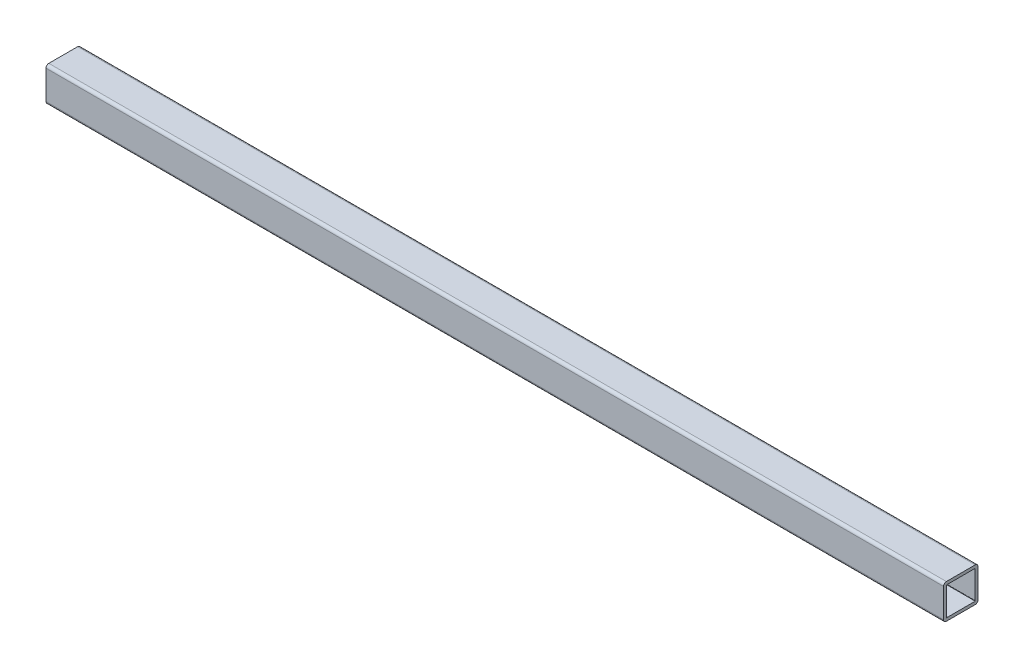
ISO-10303-21;
HEADER;
FILE_DESCRIPTION(('STEP AP214'),'2;1');
FILE_NAME('part.step','',(''),(''),'','','');
FILE_SCHEMA(('AUTOMOTIVE_DESIGN { 1 0 10303 214 1 1 1 1 }'));
ENDSEC;
DATA;
#1=APPLICATION_CONTEXT('core data for automotive mechanical design processes');
#2=APPLICATION_PROTOCOL_DEFINITION('international standard','automotive_design',2000,#1);
#3=PRODUCT_CONTEXT('',#1,'mechanical');
#4=PRODUCT('Part','Part','',(#3));
#5=PRODUCT_RELATED_PRODUCT_CATEGORY('part','',(#4));
#6=PRODUCT_DEFINITION_FORMATION('','',#4);
#7=PRODUCT_DEFINITION_CONTEXT('part definition',#1,'design');
#8=PRODUCT_DEFINITION('design','',#6,#7);
#9=PRODUCT_DEFINITION_SHAPE('','',#8);
#10=(LENGTH_UNIT() NAMED_UNIT(*) SI_UNIT(.MILLI.,.METRE.));
#11=(NAMED_UNIT(*) PLANE_ANGLE_UNIT() SI_UNIT($,.RADIAN.));
#12=(NAMED_UNIT(*) SI_UNIT($,.STERADIAN.) SOLID_ANGLE_UNIT());
#13=UNCERTAINTY_MEASURE_WITH_UNIT(LENGTH_MEASURE(1.E-05),#10,'distance_accuracy_value','');
#14=(GEOMETRIC_REPRESENTATION_CONTEXT(3) GLOBAL_UNCERTAINTY_ASSIGNED_CONTEXT((#13)) GLOBAL_UNIT_ASSIGNED_CONTEXT((#10,
#11,#12)) REPRESENTATION_CONTEXT('',''));
#15=CARTESIAN_POINT('',(0.,0.,0.));
#16=DIRECTION('',(0.,0.,1.));
#17=DIRECTION('',(1.,0.,0.));
#18=AXIS2_PLACEMENT_3D('',#15,#16,#17);
#19=CARTESIAN_POINT('',(0.,7.90752776427933,24.0377469296004));
#20=DIRECTION('',(1.,0.,0.));
#21=DIRECTION('',(0.,0.,-1.));
#22=AXIS2_PLACEMENT_3D('',#19,#20,#21);
#23=PLANE('',#22);
#24=CARTESIAN_POINT('',(0.,7.90752776427933,24.0377469296004));
#25=DIRECTION('',(1.,0.,0.));
#26=DIRECTION('',(0.,0.,-1.));
#27=AXIS2_PLACEMENT_3D('',#24,#25,#26);
#28=CIRCLE('',#27,1.55033438425608);
#29=CARTESIAN_POINT('',(0.,7.90752776427933,25.5880813138565));
#30=VERTEX_POINT('',#29);
#31=CARTESIAN_POINT('',(0.,6.35719338002325,24.0377469296004));
#32=VERTEX_POINT('',#31);
#33=EDGE_CURVE('E202',#30,#32,#28,.T.);
#34=ORIENTED_EDGE('',*,*,#33,.F.);
#35=DIRECTION('',(0.,-1.,0.));
#36=VECTOR('',#35,1.);
#37=CARTESIAN_POINT('',(0.,23.8568589957672,25.5880813138565));
#38=LINE('',#37,#36);
#39=CARTESIAN_POINT('',(0.,23.8568589957672,25.5880813138565));
#40=VERTEX_POINT('',#39);
#41=EDGE_CURVE('E174',#40,#30,#38,.T.);
#42=ORIENTED_EDGE('',*,*,#41,.F.);
#43=CARTESIAN_POINT('',(0.,23.8568589957672,24.0377469296004));
#44=DIRECTION('',(1.,0.,0.));
#45=DIRECTION('',(0.,0.,-1.));
#46=AXIS2_PLACEMENT_3D('',#43,#44,#45);
#47=CIRCLE('',#46,1.55033438425608);
#48=CARTESIAN_POINT('',(0.,25.4071933800233,24.0377469296004));
#49=VERTEX_POINT('',#48);
#50=EDGE_CURVE('E180',#49,#40,#47,.T.);
#51=ORIENTED_EDGE('',*,*,#50,.F.);
#52=DIRECTION('',(0.,0.,1.));
#53=VECTOR('',#52,1.);
#54=CARTESIAN_POINT('',(0.,25.4071933800233,8.08841569811253));
#55=LINE('',#54,#53);
#56=CARTESIAN_POINT('',(0.,25.4071933800233,8.08841569811253));
#57=VERTEX_POINT('',#56);
#58=EDGE_CURVE('E187',#57,#49,#55,.T.);
#59=ORIENTED_EDGE('',*,*,#58,.F.);
#60=CARTESIAN_POINT('',(0.,23.8568589957672,8.08841569811253));
#61=DIRECTION('',(1.,0.,0.));
#62=DIRECTION('',(0.,0.,-1.));
#63=AXIS2_PLACEMENT_3D('',#60,#61,#62);
#64=CIRCLE('',#63,1.55033438425608);
#65=CARTESIAN_POINT('',(0.,23.8568589957672,6.53808131385646));
#66=VERTEX_POINT('',#65);
#67=EDGE_CURVE('E190',#66,#57,#64,.T.);
#68=ORIENTED_EDGE('',*,*,#67,.F.);
#69=DIRECTION('',(0.,1.,0.));
#70=VECTOR('',#69,1.);
#71=CARTESIAN_POINT('',(0.,7.90752776427933,6.53808131385646));
#72=LINE('',#71,#70);
#73=CARTESIAN_POINT('',(0.,7.90752776427933,6.53808131385646));
#74=VERTEX_POINT('',#73);
#75=EDGE_CURVE('E193',#74,#66,#72,.T.);
#76=ORIENTED_EDGE('',*,*,#75,.F.);
#77=CARTESIAN_POINT('',(0.,7.90752776427933,8.08841569811253));
#78=DIRECTION('',(1.,0.,0.));
#79=DIRECTION('',(0.,0.,-1.));
#80=AXIS2_PLACEMENT_3D('',#77,#78,#79);
#81=CIRCLE('',#80,1.55033438425607);
#82=CARTESIAN_POINT('',(0.,6.35719338002325,8.08841569811253));
#83=VERTEX_POINT('',#82);
#84=EDGE_CURVE('E196',#83,#74,#81,.T.);
#85=ORIENTED_EDGE('',*,*,#84,.F.);
#86=DIRECTION('',(0.,0.,-1.));
#87=VECTOR('',#86,1.);
#88=CARTESIAN_POINT('',(0.,6.35719338002325,24.0377469296004));
#89=LINE('',#88,#87);
#90=EDGE_CURVE('E199',#32,#83,#89,.T.);
#91=ORIENTED_EDGE('',*,*,#90,.F.);
#92=EDGE_LOOP('',(#34,#42,#51,#59,#68,#76,#85,#91));
#93=FACE_BOUND('',#92,.T.);
#94=CARTESIAN_POINT('',(0.,8.04464893999163,8.59516085462564));
#95=DIRECTION('',(1.,0.,0.));
#96=DIRECTION('',(0.,0.,-1.));
#97=AXIS2_PLACEMENT_3D('',#94,#95,#96);
#98=CIRCLE('',#97,0.533400000000004);
#99=CARTESIAN_POINT('',(0.,8.00819338002325,8.06300810198088));
#100=VERTEX_POINT('',#99);
#101=CARTESIAN_POINT('',(0.,8.39050290710592,8.18908131385644));
#102=VERTEX_POINT('',#101);
#103=EDGE_CURVE('E169',#100,#102,#98,.T.);
#104=ORIENTED_EDGE('',*,*,#103,.T.);
#105=DIRECTION('',(0.,1.,0.));
#106=VECTOR('',#105,1.);
#107=CARTESIAN_POINT('',(0.,8.39050290710592,8.18908131385644));
#108=LINE('',#107,#106);
#109=CARTESIAN_POINT('',(0.,23.7311761189815,8.18908131385644));
#110=VERTEX_POINT('',#109);
#111=EDGE_CURVE('E205',#102,#110,#108,.T.);
#112=ORIENTED_EDGE('',*,*,#111,.T.);
#113=CARTESIAN_POINT('',(0.,24.2630721074737,8.22910902208072));
#114=DIRECTION('',(1.,0.,0.));
#115=DIRECTION('',(0.,0.,-1.));
#116=AXIS2_PLACEMENT_3D('',#113,#114,#115);
#117=CIRCLE('',#116,0.533399999999851);
#118=CARTESIAN_POINT('',(0.,23.7561933800233,8.06300810198088));
#119=VERTEX_POINT('',#118);
#120=EDGE_CURVE('E208',#110,#119,#117,.T.);
#121=ORIENTED_EDGE('',*,*,#120,.T.);
#122=DIRECTION('',(0.,0.,1.));
#123=VECTOR('',#122,1.);
#124=CARTESIAN_POINT('',(0.,23.7561933800233,8.06300810198088));
#125=LINE('',#124,#123);
#126=CARTESIAN_POINT('',(0.,23.7561933800233,23.4036813138565));
#127=VERTEX_POINT('',#126);
#128=EDGE_CURVE('E211',#119,#127,#125,.T.);
#129=ORIENTED_EDGE('',*,*,#128,.T.);
#130=CARTESIAN_POINT('',(0.,23.2227933800232,23.4036813138564));
#131=DIRECTION('',(1.,0.,0.));
#132=DIRECTION('',(0.,0.,-1.));
#133=AXIS2_PLACEMENT_3D('',#130,#131,#132);
#134=CIRCLE('',#133,0.53340000000001);
#135=CARTESIAN_POINT('',(0.,23.2227933800233,23.9370813138565));
#136=VERTEX_POINT('',#135);
#137=EDGE_CURVE('E214',#127,#136,#134,.T.);
#138=ORIENTED_EDGE('',*,*,#137,.T.);
#139=DIRECTION('',(0.,-1.,0.));
#140=VECTOR('',#139,1.);
#141=CARTESIAN_POINT('',(0.,23.2227933800233,23.9370813138565));
#142=LINE('',#141,#140);
#143=CARTESIAN_POINT('',(0.,7.88212016814768,23.9370813138565));
#144=VERTEX_POINT('',#143);
#145=EDGE_CURVE('E217',#136,#144,#142,.T.);
#146=ORIENTED_EDGE('',*,*,#145,.T.);
#147=CARTESIAN_POINT('',(0.,8.39050290710591,23.7756423138307));
#148=DIRECTION('',(1.,0.,0.));
#149=DIRECTION('',(0.,0.,-1.));
#150=AXIS2_PLACEMENT_3D('',#147,#148,#149);
#151=CIRCLE('',#150,0.533400000000001);
#152=CARTESIAN_POINT('',(0.,8.00819338002324,23.4036813138565));
#153=VERTEX_POINT('',#152);
#154=EDGE_CURVE('E220',#144,#153,#151,.T.);
#155=ORIENTED_EDGE('',*,*,#154,.T.);
#156=DIRECTION('',(0.,0.,-1.));
#157=VECTOR('',#156,1.);
#158=CARTESIAN_POINT('',(0.,8.00819338002325,23.4036813138565));
#159=LINE('',#158,#157);
#160=EDGE_CURVE('E223',#153,#100,#159,.T.);
#161=ORIENTED_EDGE('',*,*,#160,.T.);
#162=EDGE_LOOP('',(#104,#112,#121,#129,#138,#146,#155,#161));
#163=FACE_BOUND('',#162,.T.);
#164=ADVANCED_FACE('F44',(#93,#163),#23,.F.);
#165=CARTESIAN_POINT('',(609.6,7.90752776427933,24.0377469296004));
#166=DIRECTION('',(-1.,0.,0.));
#167=DIRECTION('',(0.,-1.,0.));
#168=AXIS2_PLACEMENT_3D('',#165,#166,#167);
#169=CYLINDRICAL_SURFACE('',#168,1.55033438425608);
#170=DIRECTION('',(-1.,0.,0.));
#171=VECTOR('',#170,1.);
#172=CARTESIAN_POINT('',(609.6,6.35719338002325,24.0377469296004));
#173=LINE('',#172,#171);
#174=CARTESIAN_POINT('',(496.059468438549,6.35719338002325,24.0377469296004));
#175=VERTEX_POINT('',#174);
#176=EDGE_CURVE('E52',#175,#32,#173,.T.);
#177=ORIENTED_EDGE('',*,*,#176,.F.);
#178=CARTESIAN_POINT('',(496.059468438549,7.90752776427526,24.0377469296004));
#179=DIRECTION('',(-1.,0.,0.));
#180=DIRECTION('',(0.,-1.,0.));
#181=AXIS2_PLACEMENT_3D('',#178,#179,#180);
#182=CIRCLE('',#181,1.55033438425608);
#183=CARTESIAN_POINT('',(496.059468438549,7.90752776427933,25.5880813138565));
#184=VERTEX_POINT('',#183);
#185=EDGE_CURVE('E156',#175,#184,#182,.T.);
#186=ORIENTED_EDGE('',*,*,#185,.T.);
#187=DIRECTION('',(-1.,0.,0.));
#188=VECTOR('',#187,1.);
#189=CARTESIAN_POINT('',(609.6,7.90752776427933,25.5880813138565));
#190=LINE('',#189,#188);
#191=EDGE_CURVE('E167',#184,#30,#190,.T.);
#192=ORIENTED_EDGE('',*,*,#191,.T.);
#193=ORIENTED_EDGE('',*,*,#33,.T.);
#194=EDGE_LOOP('',(#177,#186,#192,#193));
#195=FACE_BOUND('',#194,.T.);
#196=ADVANCED_FACE('F165',(#195),#169,.T.);
#197=CARTESIAN_POINT('',(609.6,6.35719338002325,24.0377469296004));
#198=DIRECTION('',(0.,1.,0.));
#199=DIRECTION('',(0.,0.,1.));
#200=AXIS2_PLACEMENT_3D('',#197,#198,#199);
#201=PLANE('',#200);
#202=DIRECTION('',(-1.,0.,0.));
#203=VECTOR('',#202,1.);
#204=CARTESIAN_POINT('',(609.6,6.35719338002325,8.08841569811253));
#205=LINE('',#204,#203);
#206=CARTESIAN_POINT('',(496.059468438549,6.35719338002325,8.08841569811253));
#207=VERTEX_POINT('',#206);
#208=EDGE_CURVE('E227',#207,#83,#205,.T.);
#209=ORIENTED_EDGE('',*,*,#208,.F.);
#210=DIRECTION('',(0.,0.,1.));
#211=VECTOR('',#210,1.);
#212=CARTESIAN_POINT('',(496.059468438549,6.35719338002325,6.53808131385646));
#213=LINE('',#212,#211);
#214=EDGE_CURVE('E296',#207,#175,#213,.T.);
#215=ORIENTED_EDGE('',*,*,#214,.T.);
#216=ORIENTED_EDGE('',*,*,#176,.T.);
#217=ORIENTED_EDGE('',*,*,#90,.T.);
#218=EDGE_LOOP('',(#209,#215,#216,#217));
#219=FACE_BOUND('',#218,.T.);
#220=ADVANCED_FACE('F295',(#219),#201,.F.);
#221=CARTESIAN_POINT('',(609.6,7.90752776427933,8.08841569811253));
#222=DIRECTION('',(-1.,0.,0.));
#223=DIRECTION('',(0.,-1.,0.));
#224=AXIS2_PLACEMENT_3D('',#221,#222,#223);
#225=CYLINDRICAL_SURFACE('',#224,1.55033438425608);
#226=DIRECTION('',(-1.,0.,0.));
#227=VECTOR('',#226,1.);
#228=CARTESIAN_POINT('',(609.6,7.90752776427933,6.53808131385646));
#229=LINE('',#228,#227);
#230=CARTESIAN_POINT('',(496.059468438549,7.90752776427933,6.53808131385646));
#231=VERTEX_POINT('',#230);
#232=EDGE_CURVE('E229',#231,#74,#229,.T.);
#233=ORIENTED_EDGE('',*,*,#232,.F.);
#234=CARTESIAN_POINT('',(496.059468438549,7.90752776427526,8.08841569811253));
#235=DIRECTION('',(-1.,0.,0.));
#236=DIRECTION('',(0.,-1.,0.));
#237=AXIS2_PLACEMENT_3D('',#234,#235,#236);
#238=CIRCLE('',#237,1.55033438425608);
#239=EDGE_CURVE('E170',#231,#207,#238,.T.);
#240=ORIENTED_EDGE('',*,*,#239,.T.);
#241=ORIENTED_EDGE('',*,*,#208,.T.);
#242=ORIENTED_EDGE('',*,*,#84,.T.);
#243=EDGE_LOOP('',(#233,#240,#241,#242));
#244=FACE_BOUND('',#243,.T.);
#245=ADVANCED_FACE('F305',(#244),#225,.T.);
#246=CARTESIAN_POINT('',(609.6,7.90752776427933,6.53808131385646));
#247=DIRECTION('',(0.,0.,1.));
#248=DIRECTION('',(0.,-1.,0.));
#249=AXIS2_PLACEMENT_3D('',#246,#247,#248);
#250=PLANE('',#249);
#251=DIRECTION('',(-1.,0.,0.));
#252=VECTOR('',#251,1.);
#253=CARTESIAN_POINT('',(609.6,23.8568589957672,6.53808131385646));
#254=LINE('',#253,#252);
#255=CARTESIAN_POINT('',(496.059468438549,23.8568589957651,6.53808131385646));
#256=VERTEX_POINT('',#255);
#257=EDGE_CURVE('E231',#256,#66,#254,.T.);
#258=ORIENTED_EDGE('',*,*,#257,.F.);
#259=DIRECTION('',(0.,-1.,0.));
#260=VECTOR('',#259,1.);
#261=CARTESIAN_POINT('',(496.059468438549,25.4071933800233,6.53808131385646));
#262=LINE('',#261,#260);
#263=EDGE_CURVE('E161',#256,#231,#262,.T.);
#264=ORIENTED_EDGE('',*,*,#263,.T.);
#265=ORIENTED_EDGE('',*,*,#232,.T.);
#266=ORIENTED_EDGE('',*,*,#75,.T.);
#267=EDGE_LOOP('',(#258,#264,#265,#266));
#268=FACE_BOUND('',#267,.T.);
#269=ADVANCED_FACE('F303',(#268),#250,.F.);
#270=CARTESIAN_POINT('',(609.6,23.8568589957672,8.08841569811253));
#271=DIRECTION('',(-1.,0.,0.));
#272=DIRECTION('',(0.,-1.,0.));
#273=AXIS2_PLACEMENT_3D('',#270,#271,#272);
#274=CYLINDRICAL_SURFACE('',#273,1.55033438425608);
#275=DIRECTION('',(-1.,0.,0.));
#276=VECTOR('',#275,1.);
#277=CARTESIAN_POINT('',(609.6,25.4071933800233,8.08841569811253));
#278=LINE('',#277,#276);
#279=CARTESIAN_POINT('',(496.059468438549,25.4071933800233,8.08841569811253));
#280=VERTEX_POINT('',#279);
#281=EDGE_CURVE('E233',#280,#57,#278,.T.);
#282=ORIENTED_EDGE('',*,*,#281,.F.);
#283=CARTESIAN_POINT('',(496.059468438549,23.8568589957631,8.08841569811253));
#284=DIRECTION('',(-1.,0.,0.));
#285=DIRECTION('',(0.,-1.,0.));
#286=AXIS2_PLACEMENT_3D('',#283,#284,#285);
#287=CIRCLE('',#286,1.55033438425608);
#288=EDGE_CURVE('E284',#280,#256,#287,.T.);
#289=ORIENTED_EDGE('',*,*,#288,.T.);
#290=ORIENTED_EDGE('',*,*,#257,.T.);
#291=ORIENTED_EDGE('',*,*,#67,.T.);
#292=EDGE_LOOP('',(#282,#289,#290,#291));
#293=FACE_BOUND('',#292,.T.);
#294=ADVANCED_FACE('F310',(#293),#274,.T.);
#295=CARTESIAN_POINT('',(609.6,25.4071933800233,8.08841569811253));
#296=DIRECTION('',(0.,-1.,0.));
#297=DIRECTION('',(0.,0.,-1.));
#298=AXIS2_PLACEMENT_3D('',#295,#296,#297);
#299=PLANE('',#298);
#300=DIRECTION('',(-1.,0.,0.));
#301=VECTOR('',#300,1.);
#302=CARTESIAN_POINT('',(609.6,25.4071933800233,24.0377469296004));
#303=LINE('',#302,#301);
#304=CARTESIAN_POINT('',(496.059468438549,25.4071933800233,24.0377469296004));
#305=VERTEX_POINT('',#304);
#306=EDGE_CURVE('E178',#305,#49,#303,.T.);
#307=ORIENTED_EDGE('',*,*,#306,.F.);
#308=DIRECTION('',(0.,0.,1.));
#309=VECTOR('',#308,1.);
#310=CARTESIAN_POINT('',(496.059468438549,25.4071933800233,6.53808131385646));
#311=LINE('',#310,#309);
#312=EDGE_CURVE('E273',#280,#305,#311,.T.);
#313=ORIENTED_EDGE('',*,*,#312,.F.);
#314=ORIENTED_EDGE('',*,*,#281,.T.);
#315=ORIENTED_EDGE('',*,*,#58,.T.);
#316=EDGE_LOOP('',(#307,#313,#314,#315));
#317=FACE_BOUND('',#316,.T.);
#318=ADVANCED_FACE('F314',(#317),#299,.F.);
#319=CARTESIAN_POINT('',(609.6,23.8568589957672,24.0377469296004));
#320=DIRECTION('',(-1.,0.,0.));
#321=DIRECTION('',(0.,-1.,0.));
#322=AXIS2_PLACEMENT_3D('',#319,#320,#321);
#323=CYLINDRICAL_SURFACE('',#322,1.55033438425608);
#324=DIRECTION('',(-1.,0.,0.));
#325=VECTOR('',#324,1.);
#326=CARTESIAN_POINT('',(609.6,23.8568589957672,25.5880813138565));
#327=LINE('',#326,#325);
#328=CARTESIAN_POINT('',(496.059468438549,23.8568589957672,25.5880813138565));
#329=VERTEX_POINT('',#328);
#330=EDGE_CURVE('E176',#329,#40,#327,.T.);
#331=ORIENTED_EDGE('',*,*,#330,.F.);
#332=CARTESIAN_POINT('',(496.059468438549,23.8568589957631,24.0377469296004));
#333=DIRECTION('',(-1.,0.,0.));
#334=DIRECTION('',(0.,-1.,0.));
#335=AXIS2_PLACEMENT_3D('',#332,#333,#334);
#336=CIRCLE('',#335,1.55033438425608);
#337=EDGE_CURVE('E59',#329,#305,#336,.T.);
#338=ORIENTED_EDGE('',*,*,#337,.T.);
#339=ORIENTED_EDGE('',*,*,#306,.T.);
#340=ORIENTED_EDGE('',*,*,#50,.T.);
#341=EDGE_LOOP('',(#331,#338,#339,#340));
#342=FACE_BOUND('',#341,.T.);
#343=ADVANCED_FACE('F316',(#342),#323,.T.);
#344=CARTESIAN_POINT('',(609.6,23.8568589957672,25.5880813138565));
#345=DIRECTION('',(0.,0.,-1.));
#346=DIRECTION('',(0.,1.,0.));
#347=AXIS2_PLACEMENT_3D('',#344,#345,#346);
#348=PLANE('',#347);
#349=ORIENTED_EDGE('',*,*,#191,.F.);
#350=DIRECTION('',(0.,-1.,0.));
#351=VECTOR('',#350,1.);
#352=CARTESIAN_POINT('',(496.059468438549,25.4071933800233,25.5880813138565));
#353=LINE('',#352,#351);
#354=EDGE_CURVE('E153',#329,#184,#353,.T.);
#355=ORIENTED_EDGE('',*,*,#354,.F.);
#356=ORIENTED_EDGE('',*,*,#330,.T.);
#357=ORIENTED_EDGE('',*,*,#41,.T.);
#358=EDGE_LOOP('',(#349,#355,#356,#357));
#359=FACE_BOUND('',#358,.T.);
#360=ADVANCED_FACE('F172',(#359),#348,.F.);
#361=CARTESIAN_POINT('',(609.6,8.04464893999163,8.59516085462564));
#362=DIRECTION('',(-1.,-1.04070399758638E-13,0.));
#363=DIRECTION('',(1.04070399758638E-13,-1.,0.));
#364=AXIS2_PLACEMENT_3D('',#361,#362,#363);
#365=CYLINDRICAL_SURFACE('',#364,0.533400000000002);
#366=CARTESIAN_POINT('',(496.059468438549,8.04464893997982,8.59516085462564));
#367=DIRECTION('',(-1.,0.,0.));
#368=DIRECTION('',(0.,-1.,0.));
#369=AXIS2_PLACEMENT_3D('',#366,#367,#368);
#370=CIRCLE('',#369,0.533400000000002);
#371=CARTESIAN_POINT('',(496.059468438549,8.39050290710592,8.18908131385644));
#372=VERTEX_POINT('',#371);
#373=CARTESIAN_POINT('',(496.059468438549,8.00819338002325,8.06300810198088));
#374=VERTEX_POINT('',#373);
#375=EDGE_CURVE('E66',#372,#374,#370,.T.);
#376=ORIENTED_EDGE('',*,*,#375,.F.);
#377=DIRECTION('',(-1.,0.,0.));
#378=VECTOR('',#377,1.);
#379=CARTESIAN_POINT('',(609.6,8.39050290710592,8.18908131385644));
#380=LINE('',#379,#378);
#381=EDGE_CURVE('E238',#372,#102,#380,.T.);
#382=ORIENTED_EDGE('',*,*,#381,.T.);
#383=ORIENTED_EDGE('',*,*,#103,.F.);
#384=DIRECTION('',(-1.,0.,0.));
#385=VECTOR('',#384,1.);
#386=CARTESIAN_POINT('',(609.6,8.00819338002325,8.06300810198088));
#387=LINE('',#386,#385);
#388=EDGE_CURVE('E226',#374,#100,#387,.T.);
#389=ORIENTED_EDGE('',*,*,#388,.F.);
#390=EDGE_LOOP('',(#376,#382,#383,#389));
#391=FACE_BOUND('',#390,.T.);
#392=ADVANCED_FACE('F323',(#391),#365,.F.);
#393=CARTESIAN_POINT('',(609.6,8.39050290710592,8.18908131385644));
#394=DIRECTION('',(0.,0.,1.));
#395=DIRECTION('',(1.,0.,0.));
#396=AXIS2_PLACEMENT_3D('',#393,#394,#395);
#397=PLANE('',#396);
#398=DIRECTION('',(0.,-1.,0.));
#399=VECTOR('',#398,1.);
#400=CARTESIAN_POINT('',(496.059468438549,8.39050290710525,8.18908131385644));
#401=LINE('',#400,#399);
#402=CARTESIAN_POINT('',(496.059468438549,23.7311761189697,8.18908131385556));
#403=VERTEX_POINT('',#402);
#404=EDGE_CURVE('E280',#403,#372,#401,.T.);
#405=ORIENTED_EDGE('',*,*,#404,.F.);
#406=DIRECTION('',(-1.,0.,0.));
#407=VECTOR('',#406,1.);
#408=CARTESIAN_POINT('',(609.6,23.7311761189815,8.18908131385644));
#409=LINE('',#408,#407);
#410=EDGE_CURVE('E240',#403,#110,#409,.T.);
#411=ORIENTED_EDGE('',*,*,#410,.T.);
#412=ORIENTED_EDGE('',*,*,#111,.F.);
#413=ORIENTED_EDGE('',*,*,#381,.F.);
#414=EDGE_LOOP('',(#405,#411,#412,#413));
#415=FACE_BOUND('',#414,.T.);
#416=ADVANCED_FACE('F374',(#415),#397,.T.);
#417=CARTESIAN_POINT('',(609.6,24.2630721074739,8.22910902208074));
#418=DIRECTION('',(-1.,-1.04070399758638E-13,0.));
#419=DIRECTION('',(1.04070399758638E-13,-1.,0.));
#420=AXIS2_PLACEMENT_3D('',#417,#418,#419);
#421=CYLINDRICAL_SURFACE('',#420,0.533400000000003);
#422=CARTESIAN_POINT('',(496.059468438549,24.2630721074621,8.22910902208074));
#423=DIRECTION('',(-1.,0.,0.));
#424=DIRECTION('',(0.,-1.,0.));
#425=AXIS2_PLACEMENT_3D('',#422,#423,#424);
#426=CIRCLE('',#425,0.533400000000003);
#427=CARTESIAN_POINT('',(496.059468438549,23.7561933800233,8.06300810198088));
#428=VERTEX_POINT('',#427);
#429=EDGE_CURVE('E278',#428,#403,#426,.T.);
#430=ORIENTED_EDGE('',*,*,#429,.F.);
#431=DIRECTION('',(-1.,0.,0.));
#432=VECTOR('',#431,1.);
#433=CARTESIAN_POINT('',(609.6,23.7561933800233,8.06300810198088));
#434=LINE('',#433,#432);
#435=EDGE_CURVE('E242',#428,#119,#434,.T.);
#436=ORIENTED_EDGE('',*,*,#435,.T.);
#437=ORIENTED_EDGE('',*,*,#120,.F.);
#438=ORIENTED_EDGE('',*,*,#410,.F.);
#439=EDGE_LOOP('',(#430,#436,#437,#438));
#440=FACE_BOUND('',#439,.T.);
#441=ADVANCED_FACE('F383',(#440),#421,.F.);
#442=CARTESIAN_POINT('',(609.6,23.7561933800233,8.06300810198088));
#443=DIRECTION('',(0.,-1.,0.));
#444=DIRECTION('',(0.,0.,-1.));
#445=AXIS2_PLACEMENT_3D('',#442,#443,#444);
#446=PLANE('',#445);
#447=DIRECTION('',(0.,0.,-1.));
#448=VECTOR('',#447,1.);
#449=CARTESIAN_POINT('',(496.059468438549,23.7561933800233,8.06300810198088));
#450=LINE('',#449,#448);
#451=CARTESIAN_POINT('',(496.059468438549,23.7561933800114,23.4036813138565));
#452=VERTEX_POINT('',#451);
#453=EDGE_CURVE('E271',#452,#428,#450,.T.);
#454=ORIENTED_EDGE('',*,*,#453,.F.);
#455=DIRECTION('',(-1.,0.,0.));
#456=VECTOR('',#455,1.);
#457=CARTESIAN_POINT('',(609.6,23.7561933800233,23.4036813138565));
#458=LINE('',#457,#456);
#459=EDGE_CURVE('E244',#452,#127,#458,.T.);
#460=ORIENTED_EDGE('',*,*,#459,.T.);
#461=ORIENTED_EDGE('',*,*,#128,.F.);
#462=ORIENTED_EDGE('',*,*,#435,.F.);
#463=EDGE_LOOP('',(#454,#460,#461,#462));
#464=FACE_BOUND('',#463,.T.);
#465=ADVANCED_FACE('F392',(#464),#446,.T.);
#466=CARTESIAN_POINT('',(609.6,23.2227933800233,23.4036813138565));
#467=DIRECTION('',(-1.,-1.04070399758638E-13,0.));
#468=DIRECTION('',(1.04070399758638E-13,-1.,0.));
#469=AXIS2_PLACEMENT_3D('',#466,#467,#468);
#470=CYLINDRICAL_SURFACE('',#469,0.533400000000003);
#471=CARTESIAN_POINT('',(496.059468438549,23.2227933800114,23.4036813138565));
#472=DIRECTION('',(-1.,0.,0.));
#473=DIRECTION('',(0.,-1.,0.));
#474=AXIS2_PLACEMENT_3D('',#471,#472,#473);
#475=CIRCLE('',#474,0.533400000000003);
#476=CARTESIAN_POINT('',(496.059468438549,23.2227933800233,23.9370813138565));
#477=VERTEX_POINT('',#476);
#478=EDGE_CURVE('E269',#477,#452,#475,.T.);
#479=ORIENTED_EDGE('',*,*,#478,.F.);
#480=DIRECTION('',(-1.,0.,0.));
#481=VECTOR('',#480,1.);
#482=CARTESIAN_POINT('',(609.6,23.2227933800233,23.9370813138565));
#483=LINE('',#482,#481);
#484=EDGE_CURVE('E246',#477,#136,#483,.T.);
#485=ORIENTED_EDGE('',*,*,#484,.T.);
#486=ORIENTED_EDGE('',*,*,#137,.F.);
#487=ORIENTED_EDGE('',*,*,#459,.F.);
#488=EDGE_LOOP('',(#479,#485,#486,#487));
#489=FACE_BOUND('',#488,.T.);
#490=ADVANCED_FACE('F401',(#489),#470,.F.);
#491=CARTESIAN_POINT('',(609.6,23.2227933800233,23.9370813138565));
#492=DIRECTION('',(0.,0.,-1.));
#493=DIRECTION('',(-1.,0.,0.));
#494=AXIS2_PLACEMENT_3D('',#491,#492,#493);
#495=PLANE('',#494);
#496=DIRECTION('',(0.,1.,0.));
#497=VECTOR('',#496,1.);
#498=CARTESIAN_POINT('',(496.059468438549,23.2227933800226,23.9370813138565));
#499=LINE('',#498,#497);
#500=CARTESIAN_POINT('',(496.059468438549,7.88212016813694,23.9370813138599));
#501=VERTEX_POINT('',#500);
#502=EDGE_CURVE('E267',#501,#477,#499,.T.);
#503=ORIENTED_EDGE('',*,*,#502,.F.);
#504=DIRECTION('',(-1.,0.,0.));
#505=VECTOR('',#504,1.);
#506=CARTESIAN_POINT('',(609.6,7.88212016814768,23.9370813138565));
#507=LINE('',#506,#505);
#508=EDGE_CURVE('E248',#501,#144,#507,.T.);
#509=ORIENTED_EDGE('',*,*,#508,.T.);
#510=ORIENTED_EDGE('',*,*,#145,.F.);
#511=ORIENTED_EDGE('',*,*,#484,.F.);
#512=EDGE_LOOP('',(#503,#509,#510,#511));
#513=FACE_BOUND('',#512,.T.);
#514=ADVANCED_FACE('F266',(#513),#495,.T.);
#515=CARTESIAN_POINT('',(609.6,8.39050290710592,23.7756423138307));
#516=DIRECTION('',(-1.,-1.04070399758638E-13,0.));
#517=DIRECTION('',(1.04070399758638E-13,-1.,0.));
#518=AXIS2_PLACEMENT_3D('',#515,#516,#517);
#519=CYLINDRICAL_SURFACE('',#518,0.533400000000002);
#520=CARTESIAN_POINT('',(496.059468438549,8.3905029070941,23.7756423138307));
#521=DIRECTION('',(-1.,0.,0.));
#522=DIRECTION('',(0.,-1.,0.));
#523=AXIS2_PLACEMENT_3D('',#520,#521,#522);
#524=CIRCLE('',#523,0.533400000000002);
#525=CARTESIAN_POINT('',(496.059468438549,8.00819338002325,23.4036813138565));
#526=VERTEX_POINT('',#525);
#527=EDGE_CURVE('E256',#526,#501,#524,.T.);
#528=ORIENTED_EDGE('',*,*,#527,.F.);
#529=DIRECTION('',(-1.,0.,0.));
#530=VECTOR('',#529,1.);
#531=CARTESIAN_POINT('',(609.6,8.00819338002324,23.4036813138565));
#532=LINE('',#531,#530);
#533=EDGE_CURVE('E237',#526,#153,#532,.T.);
#534=ORIENTED_EDGE('',*,*,#533,.T.);
#535=ORIENTED_EDGE('',*,*,#154,.F.);
#536=ORIENTED_EDGE('',*,*,#508,.F.);
#537=EDGE_LOOP('',(#528,#534,#535,#536));
#538=FACE_BOUND('',#537,.T.);
#539=ADVANCED_FACE('F254',(#538),#519,.F.);
#540=CARTESIAN_POINT('',(609.6,8.00819338002325,23.4036813138565));
#541=DIRECTION('',(0.,1.,0.));
#542=DIRECTION('',(0.,0.,1.));
#543=AXIS2_PLACEMENT_3D('',#540,#541,#542);
#544=PLANE('',#543);
#545=DIRECTION('',(0.,0.,1.));
#546=VECTOR('',#545,1.);
#547=CARTESIAN_POINT('',(496.059468438549,8.00819338002325,23.4036813138565));
#548=LINE('',#547,#546);
#549=EDGE_CURVE('E11',#374,#526,#548,.T.);
#550=ORIENTED_EDGE('',*,*,#549,.F.);
#551=ORIENTED_EDGE('',*,*,#388,.T.);
#552=ORIENTED_EDGE('',*,*,#160,.F.);
#553=ORIENTED_EDGE('',*,*,#533,.F.);
#554=EDGE_LOOP('',(#550,#551,#552,#553));
#555=FACE_BOUND('',#554,.T.);
#556=ADVANCED_FACE('F46',(#555),#544,.T.);
#557=CARTESIAN_POINT('',(496.059468438549,25.4071933800233,6.53808131385646));
#558=DIRECTION('',(-1.,0.,0.));
#559=DIRECTION('',(0.,-1.,0.));
#560=AXIS2_PLACEMENT_3D('',#557,#558,#559);
#561=PLANE('',#560);
#562=ORIENTED_EDGE('',*,*,#375,.T.);
#563=ORIENTED_EDGE('',*,*,#549,.T.);
#564=ORIENTED_EDGE('',*,*,#527,.T.);
#565=ORIENTED_EDGE('',*,*,#502,.T.);
#566=ORIENTED_EDGE('',*,*,#478,.T.);
#567=ORIENTED_EDGE('',*,*,#453,.T.);
#568=ORIENTED_EDGE('',*,*,#429,.T.);
#569=ORIENTED_EDGE('',*,*,#404,.T.);
#570=EDGE_LOOP('',(#562,#563,#564,#565,#566,#567,#568,#569));
#571=FACE_BOUND('',#570,.T.);
#572=ORIENTED_EDGE('',*,*,#214,.F.);
#573=ORIENTED_EDGE('',*,*,#239,.F.);
#574=ORIENTED_EDGE('',*,*,#263,.F.);
#575=ORIENTED_EDGE('',*,*,#288,.F.);
#576=ORIENTED_EDGE('',*,*,#312,.T.);
#577=ORIENTED_EDGE('',*,*,#337,.F.);
#578=ORIENTED_EDGE('',*,*,#354,.T.);
#579=ORIENTED_EDGE('',*,*,#185,.F.);
#580=EDGE_LOOP('',(#572,#573,#574,#575,#576,#577,#578,#579));
#581=FACE_BOUND('',#580,.T.);
#582=ADVANCED_FACE('F155',(#571,#581),#561,.F.);
#583=CLOSED_SHELL('',(#164,#196,#220,#245,#269,#294,#318,#343,#360,#392,#416,#441,#465,#490,
#514,#539,#556,#582));
#584=MANIFOLD_SOLID_BREP('B2',#583);
#585=ADVANCED_BREP_SHAPE_REPRESENTATION('',(#18,#584),#14);
#586=SHAPE_DEFINITION_REPRESENTATION(#9,#585);
ENDSEC;
END-ISO-10303-21;
